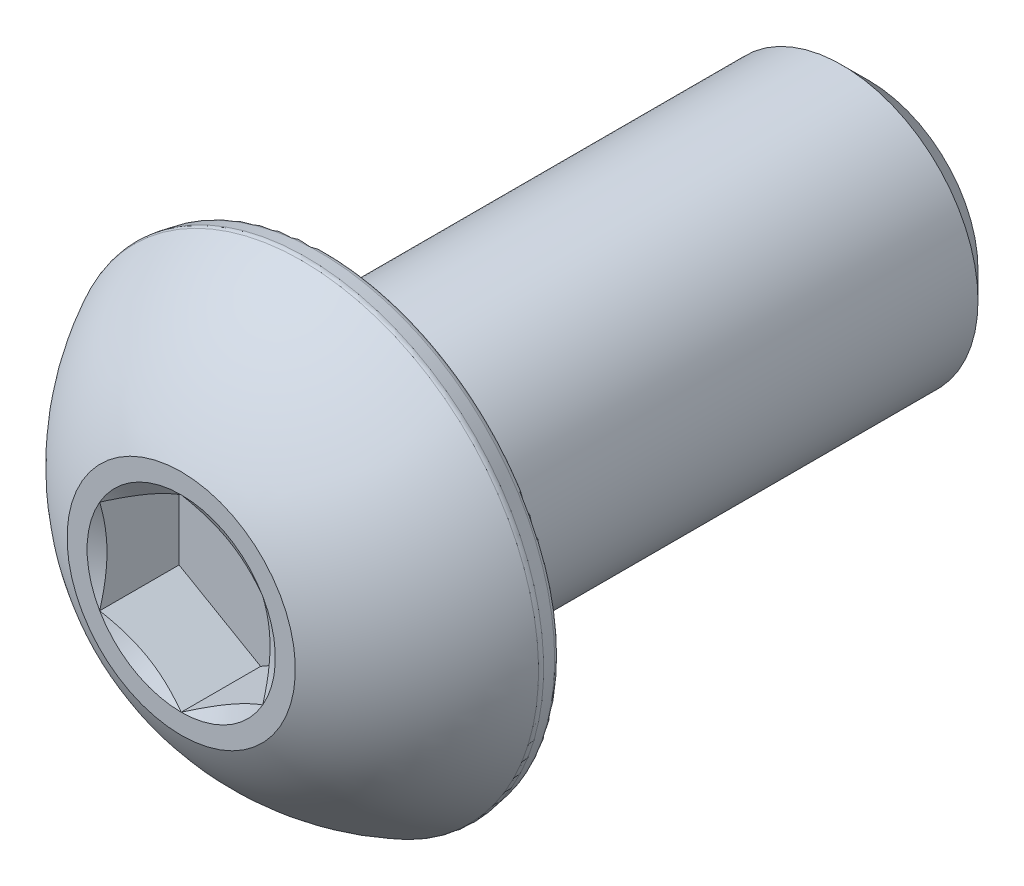
ISO-10303-21;
HEADER;
FILE_DESCRIPTION(('STEP AP214'),'2;1');
FILE_NAME('part.step','',(''),(''),'','','');
FILE_SCHEMA(('AUTOMOTIVE_DESIGN { 1 0 10303 214 1 1 1 1 }'));
ENDSEC;
DATA;
#1=APPLICATION_CONTEXT('core data for automotive mechanical design processes');
#2=APPLICATION_PROTOCOL_DEFINITION('international standard','automotive_design',2000,#1);
#3=PRODUCT_CONTEXT('',#1,'mechanical');
#4=PRODUCT('Part','Part','',(#3));
#5=PRODUCT_RELATED_PRODUCT_CATEGORY('part','',(#4));
#6=PRODUCT_DEFINITION_FORMATION('','',#4);
#7=PRODUCT_DEFINITION_CONTEXT('part definition',#1,'design');
#8=PRODUCT_DEFINITION('design','',#6,#7);
#9=PRODUCT_DEFINITION_SHAPE('','',#8);
#10=(LENGTH_UNIT() NAMED_UNIT(*) SI_UNIT(.MILLI.,.METRE.));
#11=(NAMED_UNIT(*) PLANE_ANGLE_UNIT() SI_UNIT($,.RADIAN.));
#12=(NAMED_UNIT(*) SI_UNIT($,.STERADIAN.) SOLID_ANGLE_UNIT());
#13=UNCERTAINTY_MEASURE_WITH_UNIT(LENGTH_MEASURE(1.E-05),#10,'distance_accuracy_value','');
#14=(GEOMETRIC_REPRESENTATION_CONTEXT(3) GLOBAL_UNCERTAINTY_ASSIGNED_CONTEXT((#13)) GLOBAL_UNIT_ASSIGNED_CONTEXT((#10,
#11,#12)) REPRESENTATION_CONTEXT('',''));
#15=CARTESIAN_POINT('',(0.,0.,0.));
#16=DIRECTION('',(0.,0.,1.));
#17=DIRECTION('',(1.,0.,0.));
#18=AXIS2_PLACEMENT_3D('',#15,#16,#17);
#19=CARTESIAN_POINT('',(0.,0.,10.0457));
#20=DIRECTION('',(0.,0.,-1.));
#21=DIRECTION('',(-1.,0.,0.));
#22=AXIS2_PLACEMENT_3D('',#19,#20,#21);
#23=PLANE('',#22);
#24=CARTESIAN_POINT('',(0.,0.,10.0457));
#25=DIRECTION('',(0.,0.,1.));
#26=DIRECTION('',(1.,0.,0.));
#27=AXIS2_PLACEMENT_3D('',#24,#25,#26);
#28=CIRCLE('',#27,2.74963065701559);
#29=CARTESIAN_POINT('',(-2.38125,1.3748153285078,10.0457));
#30=VERTEX_POINT('',#29);
#31=CARTESIAN_POINT('',(-2.38125,-1.3748153285078,10.0457));
#32=VERTEX_POINT('',#31);
#33=EDGE_CURVE('E87',#30,#32,#28,.T.);
#34=ORIENTED_EDGE('',*,*,#33,.F.);
#35=CARTESIAN_POINT('',(0.,2.74963065701559,10.0457));
#36=VERTEX_POINT('',#35);
#37=EDGE_CURVE('E96',#36,#30,#28,.T.);
#38=ORIENTED_EDGE('',*,*,#37,.F.);
#39=CARTESIAN_POINT('',(2.38125,1.3748153285078,10.0457));
#40=VERTEX_POINT('',#39);
#41=EDGE_CURVE('E47',#40,#36,#28,.T.);
#42=ORIENTED_EDGE('',*,*,#41,.F.);
#43=CARTESIAN_POINT('',(2.38125,-1.3748153285078,10.0457));
#44=VERTEX_POINT('',#43);
#45=EDGE_CURVE('E54',#44,#40,#28,.T.);
#46=ORIENTED_EDGE('',*,*,#45,.F.);
#47=CARTESIAN_POINT('',(0.,-2.74963065701559,10.0457));
#48=VERTEX_POINT('',#47);
#49=EDGE_CURVE('E129',#48,#44,#28,.T.);
#50=ORIENTED_EDGE('',*,*,#49,.F.);
#51=EDGE_CURVE('E97',#32,#48,#28,.T.);
#52=ORIENTED_EDGE('',*,*,#51,.F.);
#53=EDGE_LOOP('',(#34,#38,#42,#46,#50,#52));
#54=FACE_BOUND('',#53,.T.);
#55=CARTESIAN_POINT('',(0.,0.,10.0457));
#56=DIRECTION('',(0.,0.,1.));
#57=DIRECTION('',(1.,0.,0.));
#58=AXIS2_PLACEMENT_3D('',#55,#56,#57);
#59=CIRCLE('',#58,3.33375);
#60=CARTESIAN_POINT('',(0.,3.33375,10.0457));
#61=VERTEX_POINT('',#60);
#62=EDGE_CURVE('E108',#61,#61,#59,.T.);
#63=ORIENTED_EDGE('',*,*,#62,.T.);
#64=EDGE_LOOP('',(#63));
#65=FACE_BOUND('',#64,.T.);
#66=ADVANCED_FACE('F33',(#54,#65),#23,.F.);
#67=CARTESIAN_POINT('',(0.,0.,3.0715100761871));
#68=DIRECTION('',(0.,0.,1.));
#69=DIRECTION('',(0.,1.,0.));
#70=AXIS2_PLACEMENT_3D('',#67,#68,#69);
#71=SPHERICAL_SURFACE('',#70,7.7300203205369);
#72=CARTESIAN_POINT('',(0.,0.,6.52454018330078));
#73=DIRECTION('',(0.,0.,-1.));
#74=DIRECTION('',(-1.,0.,0.));
#75=AXIS2_PLACEMENT_3D('',#72,#73,#74);
#76=CIRCLE('',#75,6.9159089955898);
#77=CARTESIAN_POINT('',(0.,6.91590899558979,6.52454018330078));
#78=VERTEX_POINT('',#77);
#79=EDGE_CURVE('E107',#78,#78,#76,.F.);
#80=CARTESIAN_POINT('',(0.,6.91590899558979,6.52454018330078));
#81=CARTESIAN_POINT('',(0.,6.89210420071315,6.57221785887908));
#82=CARTESIAN_POINT('',(0.,6.86780623065835,6.6196492946389));
#83=CARTESIAN_POINT('',(0.,6.81823466199059,6.71399957213813));
#84=CARTESIAN_POINT('',(0.,6.79296106337765,6.76091841387754));
#85=CARTESIAN_POINT('',(0.,6.74144895939183,6.85422338895248));
#86=CARTESIAN_POINT('',(0.,6.71521045401895,6.90060952228801));
#87=CARTESIAN_POINT('',(0.,6.6617797828335,6.99282925276766));
#88=CARTESIAN_POINT('',(0.,6.63458761702092,7.03866284991179));
#89=CARTESIAN_POINT('',(0.,6.57926124921401,7.12975790080985));
#90=CARTESIAN_POINT('',(0.,6.55112704721968,7.1750193545638));
#91=CARTESIAN_POINT('',(0.,6.49392864226128,7.26495076041678));
#92=CARTESIAN_POINT('',(0.,6.46486443929721,7.30962071251583));
#93=CARTESIAN_POINT('',(0.,6.40581846323881,7.3983500086603));
#94=CARTESIAN_POINT('',(0.,6.37583669014447,7.44240935270572));
#95=CARTESIAN_POINT('',(0.,6.31496839770298,7.52989858781531));
#96=CARTESIAN_POINT('',(0.,6.28408187835583,7.57332847887949));
#97=CARTESIAN_POINT('',(0.,6.22141730410836,7.65954023224645));
#98=CARTESIAN_POINT('',(0.,6.18963924920803,7.70232209454923));
#99=CARTESIAN_POINT('',(0.,6.12520519592135,7.78721949180882));
#100=CARTESIAN_POINT('',(0.,6.092549197535,7.82933502676563));
#101=CARTESIAN_POINT('',(0.,6.02637322484493,7.91288175574332));
#102=CARTESIAN_POINT('',(0.,5.99285325054121,7.9543129497642));
#103=CARTESIAN_POINT('',(0.,5.92496366312639,8.03647327598684));
#104=CARTESIAN_POINT('',(0.,5.8905940500153,8.0772024081886));
#105=CARTESIAN_POINT('',(0.,5.82101988550109,8.15794119017415));
#106=CARTESIAN_POINT('',(0.,5.78581533409797,8.19795083995793));
#107=CARTESIAN_POINT('',(0.,5.71458635063374,8.27723354424464));
#108=CARTESIAN_POINT('',(0.,5.67856191857262,8.31650659874756));
#109=CARTESIAN_POINT('',(0.,5.60570858210438,8.39429931466497));
#110=CARTESIAN_POINT('',(0.,5.56887967769726,8.43281897607945));
#111=CARTESIAN_POINT('',(0.,5.49443314893664,8.50908843025251));
#112=CARTESIAN_POINT('',(0.,5.45681552458314,8.54683822301108));
#113=CARTESIAN_POINT('',(0.,5.38080764567942,8.62155179359178));
#114=CARTESIAN_POINT('',(0.,5.3424173911292,8.65851557141393));
#115=CARTESIAN_POINT('',(0.,5.26488067204982,8.73164130203432));
#116=CARTESIAN_POINT('',(0.,5.22573420752066,8.76780325483257));
#117=CARTESIAN_POINT('',(0.,5.14670181214611,8.83930986827302));
#118=CARTESIAN_POINT('',(0.,5.10681588130072,8.87465452891522));
#119=CARTESIAN_POINT('',(0.,5.02632161323976,8.94451144048231));
#120=CARTESIAN_POINT('',(0.,4.98571327602419,8.97902369140719));
#121=CARTESIAN_POINT('',(0.,4.90379156415538,9.04720102201527));
#122=CARTESIAN_POINT('',(0.,4.86247818950214,9.08086610169847));
#123=CARTESIAN_POINT('',(0.,4.77916407324809,9.14733469064972));
#124=CARTESIAN_POINT('',(0.,4.73716333164727,9.18013819991778));
#125=CARTESIAN_POINT('',(0.,4.65249244598724,9.24486961737403));
#126=CARTESIAN_POINT('',(0.,4.60982230192803,9.27679752556221));
#127=CARTESIAN_POINT('',(0.,4.52383086215762,9.33976408470765));
#128=CARTESIAN_POINT('',(0.,4.48050956644643,9.3708027356649));
#129=CARTESIAN_POINT('',(0.,4.39323435268239,9.43197750453789));
#130=CARTESIAN_POINT('',(0.,4.34928043462955,9.46211362245364));
#131=CARTESIAN_POINT('',(0.,4.26075877609776,9.52147043550477));
#132=CARTESIAN_POINT('',(0.,4.21619103561882,9.55069113064015));
#133=CARTESIAN_POINT('',(0.,4.12646079461508,9.60820459977906));
#134=CARTESIAN_POINT('',(0.,4.08129829409027,9.63649737378258));
#135=CARTESIAN_POINT('',(0.,3.9903978500577,9.69214289977668));
#136=CARTESIAN_POINT('',(0.,3.94465990654993,9.71949565176726));
#137=CARTESIAN_POINT('',(0.,3.85262813864884,9.77324943274895));
#138=CARTESIAN_POINT('',(0.,3.80633431425552,9.79965046174005));
#139=CARTESIAN_POINT('',(0.,3.71321058852053,9.85148951090479));
#140=CARTESIAN_POINT('',(0.,3.66638068717887,9.87692753107842));
#141=CARTESIAN_POINT('',(0.,3.57220482555009,9.92682965846051));
#142=CARTESIAN_POINT('',(0.,3.52485886526298,9.95129376566896));
#143=CARTESIAN_POINT('',(0.,3.42967118129194,9.99923769233952));
#144=CARTESIAN_POINT('',(0.,3.38182945760801,10.0227175118016));
#145=CARTESIAN_POINT('',(0.,3.33375,10.0457));
#146=B_SPLINE_CURVE_WITH_KNOTS('',3,(#80,#81,#82,#83,#84,#85,#86,#87,#88,#89,#90,#91,#92,#93,
#94,#95,#96,#97,#98,#99,#100,#101,#102,#103,#104,#105,#106,#107,#108,#109,#110,#111,#112,#113,
#114,#115,#116,#117,#118,#119,#120,#121,#122,#123,#124,#125,#126,#127,#128,#129,#130,#131,#132,
#133,#134,#135,#136,#137,#138,#139,#140,#141,#142,#143,#144,#145),.UNSPECIFIED.,.F.,.F.,(4,2,2,
2,2,2,2,2,2,2,2,2,2,2,2,2,2,2,2,2,2,2,2,2,2,2,2,2,2,2,2,2,4),(0.,0.159867283823277,
0.319734567646554,0.479601851469831,0.639469135293107,0.799336419116385,0.959203702939662,
1.11907098676294,1.27893827058622,1.43880555440949,1.59867283823277,1.75854012205605,
1.91840740587932,2.0782746897026,2.23814197352588,2.39800925734915,2.55787654117243,
2.71774382499571,2.87761110881898,3.03747839264226,3.19734567646554,3.35721296028882,
3.51708024411209,3.67694752793537,3.83681481175865,3.99668209558192,4.1565493794052,
4.31641666322848,4.47628394705175,4.63615123087503,4.79601851469831,4.95588579852158,
5.11575308234486),.UNSPECIFIED.);
#147=EDGE_CURVE('BSEAM202',#78,#61,#146,.T.);
#148=ORIENTED_EDGE('',*,*,#79,.T.);
#149=ORIENTED_EDGE('',*,*,#62,.F.);
#150=ORIENTED_EDGE('',*,*,#147,.T.);
#151=ORIENTED_EDGE('',*,*,#147,.F.);
#152=EDGE_LOOP('',(#148,#150,#149,#151));
#153=FACE_BOUND('',#152,.T.);
#154=ADVANCED_FACE('F202',(#153),#71,.T.);
#155=CARTESIAN_POINT('',(0.,0.,5.8293));
#156=DIRECTION('',(0.,0.,1.));
#157=DIRECTION('',(1.,0.,0.));
#158=AXIS2_PLACEMENT_3D('',#155,#156,#157);
#159=CONICAL_SURFACE('',#158,6.83538023778113,0.174532925199432);
#160=CARTESIAN_POINT('',(0.,0.,6.39375756148203));
#161=DIRECTION('',(0.,0.,-1.));
#162=DIRECTION('',(-1.,0.,0.));
#163=AXIS2_PLACEMENT_3D('',#160,#161,#162);
#164=CIRCLE('',#163,6.93490933533532);
#165=CARTESIAN_POINT('',(-6.93490933533532,0.,6.39375756148203));
#166=VERTEX_POINT('',#165);
#167=EDGE_CURVE('E41',#166,#166,#164,.T.);
#168=ORIENTED_EDGE('',*,*,#167,.T.);
#169=EDGE_LOOP('',(#168));
#170=FACE_BOUND('',#169,.T.);
#171=CARTESIAN_POINT('',(0.,0.,6.00351149118426));
#172=DIRECTION('',(0.,0.,-1.));
#173=DIRECTION('',(-1.,0.,0.));
#174=AXIS2_PLACEMENT_3D('',#171,#172,#173);
#175=CIRCLE('',#174,6.86609842402637);
#176=CARTESIAN_POINT('',(-6.86609842402637,0.,6.00351149118426));
#177=VERTEX_POINT('',#176);
#178=EDGE_CURVE('E224',#177,#177,#175,.F.);
#179=ORIENTED_EDGE('',*,*,#178,.T.);
#180=EDGE_LOOP('',(#179));
#181=FACE_BOUND('',#180,.T.);
#182=ADVANCED_FACE('F207',(#170,#181),#159,.T.);
#183=CARTESIAN_POINT('',(0.,6.83538023778113,5.8293));
#184=DIRECTION('',(0.,0.,1.));
#185=DIRECTION('',(1.,0.,0.));
#186=AXIS2_PLACEMENT_3D('',#183,#184,#185);
#187=PLANE('',#186);
#188=CARTESIAN_POINT('',(0.,0.,5.8293));
#189=DIRECTION('',(0.,0.,1.));
#190=DIRECTION('',(1.,0.,0.));
#191=AXIS2_PLACEMENT_3D('',#188,#189,#190);
#192=CIRCLE('',#191,6.65848125353633);
#193=CARTESIAN_POINT('',(6.65848125353633,0.,5.8293));
#194=VERTEX_POINT('',#193);
#195=EDGE_CURVE('E11',#194,#194,#192,.F.);
#196=ORIENTED_EDGE('',*,*,#195,.T.);
#197=EDGE_LOOP('',(#196));
#198=FACE_BOUND('',#197,.T.);
#199=CARTESIAN_POINT('',(0.,0.,5.8293));
#200=DIRECTION('',(0.,0.,1.));
#201=DIRECTION('',(1.,0.,0.));
#202=AXIS2_PLACEMENT_3D('',#199,#200,#201);
#203=CIRCLE('',#202,3.9751);
#204=CARTESIAN_POINT('',(3.9751,0.,5.8293));
#205=VERTEX_POINT('',#204);
#206=EDGE_CURVE('E289',#205,#205,#203,.T.);
#207=ORIENTED_EDGE('',*,*,#206,.T.);
#208=EDGE_LOOP('',(#207));
#209=FACE_BOUND('',#208,.T.);
#210=ADVANCED_FACE('F230',(#198,#209),#187,.F.);
#211=CARTESIAN_POINT('',(0.,0.,10.0457));
#212=DIRECTION('',(0.,0.,1.));
#213=DIRECTION('',(1.,0.,0.));
#214=AXIS2_PLACEMENT_3D('',#211,#212,#213);
#215=CYLINDRICAL_SURFACE('',#214,3.9751);
#216=ORIENTED_EDGE('',*,*,#206,.F.);
#217=EDGE_LOOP('',(#216));
#218=FACE_BOUND('',#217,.T.);
#219=CARTESIAN_POINT('',(0.,0.,-9.25194999999998));
#220=DIRECTION('',(0.,0.,1.));
#221=DIRECTION('',(1.,0.,0.));
#222=AXIS2_PLACEMENT_3D('',#219,#220,#221);
#223=CIRCLE('',#222,3.9751);
#224=CARTESIAN_POINT('',(3.9751,0.,-9.25194999999998));
#225=VERTEX_POINT('',#224);
#226=EDGE_CURVE('E286',#225,#225,#223,.T.);
#227=ORIENTED_EDGE('',*,*,#226,.T.);
#228=EDGE_LOOP('',(#227));
#229=FACE_BOUND('',#228,.T.);
#230=ADVANCED_FACE('F236',(#218,#229),#215,.T.);
#231=CARTESIAN_POINT('',(0.,0.,-10.0457));
#232=DIRECTION('',(0.,0.,1.));
#233=DIRECTION('',(1.,0.,0.));
#234=AXIS2_PLACEMENT_3D('',#231,#232,#233);
#235=CONICAL_SURFACE('',#234,3.18134999999999,0.785398163397442);
#236=ORIENTED_EDGE('',*,*,#226,.F.);
#237=EDGE_LOOP('',(#236));
#238=FACE_BOUND('',#237,.T.);
#239=CARTESIAN_POINT('',(0.,0.,-10.0457));
#240=DIRECTION('',(0.,0.,1.));
#241=DIRECTION('',(1.,0.,0.));
#242=AXIS2_PLACEMENT_3D('',#239,#240,#241);
#243=CIRCLE('',#242,3.18134999999999);
#244=CARTESIAN_POINT('',(3.18134999999999,0.,-10.0457));
#245=VERTEX_POINT('',#244);
#246=EDGE_CURVE('E274',#245,#245,#243,.T.);
#247=ORIENTED_EDGE('',*,*,#246,.T.);
#248=EDGE_LOOP('',(#247));
#249=FACE_BOUND('',#248,.T.);
#250=ADVANCED_FACE('F242',(#238,#249),#235,.T.);
#251=CARTESIAN_POINT('',(0.,0.,-10.0457));
#252=DIRECTION('',(0.,0.,1.));
#253=DIRECTION('',(1.,0.,0.));
#254=AXIS2_PLACEMENT_3D('',#251,#252,#253);
#255=PLANE('',#254);
#256=ORIENTED_EDGE('',*,*,#246,.F.);
#257=EDGE_LOOP('',(#256));
#258=FACE_BOUND('',#257,.T.);
#259=ADVANCED_FACE('F246',(#258),#255,.F.);
#260=CARTESIAN_POINT('',(0.,0.,10.0457));
#261=DIRECTION('',(0.,0.,1.));
#262=DIRECTION('',(1.,0.,0.));
#263=AXIS2_PLACEMENT_3D('',#260,#261,#262);
#264=CONICAL_SURFACE('',#263,2.74963065701559,1.0471975511966);
#265=ORIENTED_EDGE('',*,*,#51,.T.);
#266=CARTESIAN_POINT('',(-2.38145,-1.37469985845396,10.045766670866));
#267=CARTESIAN_POINT('',(-2.27680510857802,-1.43511661468576,10.0108705786252));
#268=CARTESIAN_POINT('',(-2.1712569313955,-1.49605488319456,9.97913357277489));
#269=CARTESIAN_POINT('',(-1.95833280582789,-1.61898668440799,9.92373566282311));
#270=CARTESIAN_POINT('',(-1.85095307338658,-1.68098240183848,9.90009435758363));
#271=CARTESIAN_POINT('',(-1.63752441306379,-1.80420549632863,9.86329233539692));
#272=CARTESIAN_POINT('',(-1.53150832846243,-1.86541391131165,9.84988669656405));
#273=CARTESIAN_POINT('',(-1.31897718209788,-1.98811882587641,9.83388161450448));
#274=CARTESIAN_POINT('',(-1.21246289310218,-2.04961487930061,9.83126891931468));
#275=CARTESIAN_POINT('',(-1.01342600969027,-2.16452887751714,9.83669708045716));
#276=CARTESIAN_POINT('',(-0.920873657438137,-2.21796400300405,9.84340513694891));
#277=CARTESIAN_POINT('',(-0.736371946153154,-2.32448611568038,9.86466796071296));
#278=CARTESIAN_POINT('',(-0.644423225529254,-2.37757273428423,9.87922999512354));
#279=CARTESIAN_POINT('',(-0.459540942889936,-2.48431456993443,9.91563482881656));
#280=CARTESIAN_POINT('',(-0.366630787034621,-2.53795627342795,9.93763198497274));
#281=CARTESIAN_POINT('',(-0.182196405744562,-2.64443951311359,9.98755721470183));
#282=CARTESIAN_POINT('',(-0.0906698164537948,-2.69728241407862,10.0154735535082));
#283=CARTESIAN_POINT('',(0.000200000000000513,-2.74974612706943,10.045766670866));
#284=B_SPLINE_CURVE_WITH_KNOTS('',3,(#266,#267,#268,#269,#270,#271,#272,#273,#274,#275,#276,
#277,#278,#279,#280,#281,#282,#283),.UNSPECIFIED.,.F.,.F.,(4,2,2,2,2,2,2,2,4),(0.,
0.377463001720441,0.755833447356088,1.12483885453941,1.49339104874267,1.81432726847354,
2.1355609551887,2.46392121913821,2.79163649648301),.UNSPECIFIED.);
#285=EDGE_CURVE('E102',#32,#48,#284,.T.);
#286=ORIENTED_EDGE('',*,*,#285,.F.);
#287=EDGE_LOOP('',(#265,#286));
#288=FACE_BOUND('',#287,.T.);
#289=ADVANCED_FACE('F103',(#288),#264,.F.);
#290=ORIENTED_EDGE('',*,*,#49,.T.);
#291=CARTESIAN_POINT('',(-0.000199999999999475,-2.74974612706943,10.045766670866));
#292=CARTESIAN_POINT('',(0.104444891421977,-2.68932937083763,10.0108705786252));
#293=CARTESIAN_POINT('',(0.209993068604497,-2.62839110232883,9.97913357277489));
#294=CARTESIAN_POINT('',(0.422917194172111,-2.5054593011154,9.92373566282311));
#295=CARTESIAN_POINT('',(0.530296926613419,-2.4434635836849,9.90009435758363));
#296=CARTESIAN_POINT('',(0.743725586936214,-2.32024048919476,9.86329233539692));
#297=CARTESIAN_POINT('',(0.849741671537568,-2.25903207421173,9.84988669656405));
#298=CARTESIAN_POINT('',(1.06227281790212,-2.13632715964698,9.83388161450448));
#299=CARTESIAN_POINT('',(1.16878710689782,-2.07483110622277,9.83126891931468));
#300=CARTESIAN_POINT('',(1.36782399030972,-1.95991710800624,9.83669708045716));
#301=CARTESIAN_POINT('',(1.46037634256186,-1.90648198251934,9.84340513694891));
#302=CARTESIAN_POINT('',(1.64487805384685,-1.79995986984301,9.86466796071296));
#303=CARTESIAN_POINT('',(1.73682677447075,-1.74687325123916,9.87922999512354));
#304=CARTESIAN_POINT('',(1.92170905711006,-1.64013141558896,9.91563482881656));
#305=CARTESIAN_POINT('',(2.01461921296538,-1.58648971209544,9.93763198497274));
#306=CARTESIAN_POINT('',(2.19905359425544,-1.4800064724098,9.98755721470183));
#307=CARTESIAN_POINT('',(2.29058018354621,-1.42716357144477,10.0154735535082));
#308=CARTESIAN_POINT('',(2.38145,-1.37469985845396,10.045766670866));
#309=B_SPLINE_CURVE_WITH_KNOTS('',3,(#291,#292,#293,#294,#295,#296,#297,#298,#299,#300,#301,
#302,#303,#304,#305,#306,#307,#308),.UNSPECIFIED.,.F.,.F.,(4,2,2,2,2,2,2,2,4),(0.,
0.377463001720441,0.755833447356087,1.1248388545394,1.49339104874266,1.81432726847354,
2.1355609551887,2.46392121913821,2.79163649648301),.UNSPECIFIED.);
#310=EDGE_CURVE('E131',#48,#44,#309,.T.);
#311=ORIENTED_EDGE('',*,*,#310,.F.);
#312=EDGE_LOOP('',(#290,#311));
#313=FACE_BOUND('',#312,.T.);
#314=ADVANCED_FACE('F315',(#313),#264,.F.);
#315=ORIENTED_EDGE('',*,*,#45,.T.);
#316=CARTESIAN_POINT('',(2.38125,-3.56031432041408,10.9311327813109));
#317=CARTESIAN_POINT('',(2.38125,-3.45748374459471,10.8817985621719));
#318=CARTESIAN_POINT('',(2.38125,-3.35440265943941,10.8329767676642));
#319=CARTESIAN_POINT('',(2.38125,-3.14760595557445,10.736648717798));
#320=CARTESIAN_POINT('',(2.38125,-3.04389022671774,10.6891426991917));
#321=CARTESIAN_POINT('',(2.38125,-2.83509604479695,10.5954714977183));
#322=CARTESIAN_POINT('',(2.38125,-2.73001314180502,10.5493161964771));
#323=CARTESIAN_POINT('',(2.38125,-2.5189655488985,10.4590753131819));
#324=CARTESIAN_POINT('',(2.38125,-2.41300090517102,10.4149896235117));
#325=CARTESIAN_POINT('',(2.38125,-2.19722997657368,10.3283164755131));
#326=CARTESIAN_POINT('',(2.38125,-2.08739568642801,10.2857983262348));
#327=CARTESIAN_POINT('',(2.38125,-1.86639857650948,10.2042970218555));
#328=CARTESIAN_POINT('',(2.38125,-1.75523560433474,10.1653142767613));
#329=CARTESIAN_POINT('',(2.38125,-1.53166103833463,10.0919985594297));
#330=CARTESIAN_POINT('',(2.38125,-1.41925300915091,10.0576548339663));
#331=CARTESIAN_POINT('',(2.38125,-1.19282596671567,9.99479165918739));
#332=CARTESIAN_POINT('',(2.38125,-1.07880736110514,9.96627076337095));
#333=CARTESIAN_POINT('',(2.38125,-0.849396676134232,9.91657362588166));
#334=CARTESIAN_POINT('',(2.38125,-0.734007929376445,9.89538229924999));
#335=CARTESIAN_POINT('',(2.38125,-0.50193948238959,9.86173194464909));
#336=CARTESIAN_POINT('',(2.38125,-0.385259869941055,9.84927232657502));
#337=CARTESIAN_POINT('',(2.38125,-0.15265374437568,9.83424139756692));
#338=CARTESIAN_POINT('',(2.38125,-0.0367349582255528,9.83155339793735));
#339=CARTESIAN_POINT('',(2.38125,0.194921420761424,9.83599358753839));
#340=CARTESIAN_POINT('',(2.38125,0.310659001934531,9.84312238458818));
#341=CARTESIAN_POINT('',(2.38125,0.511064358227532,9.8634854394961));
#342=CARTESIAN_POINT('',(2.38125,0.595953717526416,9.87463938794046));
#343=CARTESIAN_POINT('',(2.38125,0.765022556422735,9.90146121817604));
#344=CARTESIAN_POINT('',(2.38125,0.849201910592196,9.91712988102057));
#345=CARTESIAN_POINT('',(2.38125,1.10063158151713,9.97007925010245));
#346=CARTESIAN_POINT('',(2.38125,1.26664254896707,10.0132883896334));
#347=CARTESIAN_POINT('',(2.38125,1.51487878922651,10.0871090899076));
#348=CARTESIAN_POINT('',(2.38125,1.59841261020007,10.1135615121722));
#349=CARTESIAN_POINT('',(2.38125,1.76461552147617,10.1689125840672));
#350=CARTESIAN_POINT('',(2.38125,1.8472851157426,10.1978097070595));
#351=CARTESIAN_POINT('',(2.38125,2.0118638893944,10.2576314662197));
#352=CARTESIAN_POINT('',(2.38125,2.09377320390112,10.2885557339181));
#353=CARTESIAN_POINT('',(2.38125,2.25694684606751,10.3520968176601));
#354=CARTESIAN_POINT('',(2.38125,2.33821106206296,10.3847139196664));
#355=CARTESIAN_POINT('',(2.38125,2.54564055797726,10.4700605981753));
#356=CARTESIAN_POINT('',(2.38125,2.67139077643561,10.5237976536597));
#357=CARTESIAN_POINT('',(2.38125,2.92175828712318,10.6338569837741));
#358=CARTESIAN_POINT('',(2.38125,3.04637549364049,10.6901794520717));
#359=CARTESIAN_POINT('',(2.38125,3.29471124185556,10.804822490172));
#360=CARTESIAN_POINT('',(2.38125,3.41842962310426,10.8631434065869));
#361=CARTESIAN_POINT('',(2.38125,3.66512129458494,10.9813427619708));
#362=CARTESIAN_POINT('',(2.38125,3.78809456817208,11.0412212355767));
#363=CARTESIAN_POINT('',(2.38125,4.15640373223128,11.2228342351465));
#364=CARTESIAN_POINT('',(2.38125,4.40083218751396,11.3464072817698));
#365=CARTESIAN_POINT('',(2.38125,4.8880155134677,11.596713712694));
#366=CARTESIAN_POINT('',(2.38125,5.13077059191436,11.7234466952773));
#367=CARTESIAN_POINT('',(2.38125,5.59226335071453,11.9670405276704));
#368=CARTESIAN_POINT('',(2.38125,5.81110530618685,12.0837041437275));
#369=CARTESIAN_POINT('',(2.38125,6.24808533417811,12.3183596021958));
#370=CARTESIAN_POINT('',(2.38125,6.46622338026151,12.4363514937607));
#371=CARTESIAN_POINT('',(2.38125,6.90140294653572,12.6730300538684));
#372=CARTESIAN_POINT('',(2.38125,7.11844584451928,12.7917141918825));
#373=CARTESIAN_POINT('',(2.38125,7.55209283139576,13.0298549301874));
#374=CARTESIAN_POINT('',(2.38125,7.7686969426581,13.1493114897285));
#375=CARTESIAN_POINT('',(2.38125,7.98514341619629,13.2690511700018));
#376=B_SPLINE_CURVE_WITH_KNOTS('',3,(#316,#317,#318,#319,#320,#321,#322,#323,#324,#325,#326,
#327,#328,#329,#330,#331,#332,#333,#334,#335,#336,#337,#338,#339,#340,#341,#342,#343,#344,#345,
#346,#347,#348,#349,#350,#351,#352,#353,#354,#355,#356,#357,#358,#359,#360,#361,#362,#363,#364,
#365,#366,#367,#368,#369,#370,#371,#372,#373,#374,#375),.UNSPECIFIED.,.F.,.F.,(4,2,2,2,2,2,2,2,
2,2,2,2,2,2,2,2,2,2,2,2,2,2,2,2,2,2,2,2,2,4),(0.,0.34216262334821,0.684386418445571,
1.02868615523156,1.37296796912697,1.72625126026709,2.07957547001313,2.43206608144725,
2.78446902072291,3.13614230382947,3.48779181791892,3.83522802132629,4.18268573764542,
4.43941585883896,4.69619042147775,5.21013322351853,5.47298093255488,5.73566569629106,
5.99830284411161,6.26098450333651,6.67119502065648,7.08143631626132,7.49174912817907,
7.90207107246849,8.72369797816941,9.54522095899754,10.2892038704941,11.0332144046983,
11.7753325322695,12.5174118231823),.UNSPECIFIED.);
#377=EDGE_CURVE('E140',#44,#40,#376,.T.);
#378=ORIENTED_EDGE('',*,*,#377,.F.);
#379=EDGE_LOOP('',(#315,#378));
#380=FACE_BOUND('',#379,.T.);
#381=ADVANCED_FACE('F311',(#380),#264,.F.);
#382=ORIENTED_EDGE('',*,*,#41,.T.);
#383=CARTESIAN_POINT('',(2.38145,1.37469985845396,10.045766670866));
#384=CARTESIAN_POINT('',(2.27680510857802,1.43511661468576,10.0108705786252));
#385=CARTESIAN_POINT('',(2.1712569313955,1.49605488319456,9.97913357277489));
#386=CARTESIAN_POINT('',(1.95833280582789,1.61898668440799,9.92373566282311));
#387=CARTESIAN_POINT('',(1.85095307338658,1.68098240183849,9.90009435758363));
#388=CARTESIAN_POINT('',(1.63752441306379,1.80420549632863,9.86329233539692));
#389=CARTESIAN_POINT('',(1.53150832846243,1.86541391131166,9.84988669656405));
#390=CARTESIAN_POINT('',(1.31897718209788,1.98811882587641,9.83388161450448));
#391=CARTESIAN_POINT('',(1.21246289310218,2.04961487930062,9.83126891931468));
#392=CARTESIAN_POINT('',(1.01342600969027,2.16452887751715,9.83669708045716));
#393=CARTESIAN_POINT('',(0.920873657438137,2.21796400300405,9.84340513694891));
#394=CARTESIAN_POINT('',(0.736371946153154,2.32448611568038,9.86466796071296));
#395=CARTESIAN_POINT('',(0.644423225529254,2.37757273428423,9.87922999512354));
#396=CARTESIAN_POINT('',(0.459540942889936,2.48431456993443,9.91563482881656));
#397=CARTESIAN_POINT('',(0.366630787034621,2.53795627342795,9.93763198497274));
#398=CARTESIAN_POINT('',(0.182196405744562,2.64443951311359,9.98755721470183));
#399=CARTESIAN_POINT('',(0.0906698164537951,2.69728241407862,10.0154735535082));
#400=CARTESIAN_POINT('',(-0.000200000000000014,2.74974612706943,10.045766670866));
#401=B_SPLINE_CURVE_WITH_KNOTS('',3,(#383,#384,#385,#386,#387,#388,#389,#390,#391,#392,#393,
#394,#395,#396,#397,#398,#399,#400),.UNSPECIFIED.,.F.,.F.,(4,2,2,2,2,2,2,2,4),(0.,
0.377463001720441,0.755833447356088,1.12483885453941,1.49339104874267,1.81432726847354,
2.1355609551887,2.46392121913821,2.79163649648301),.UNSPECIFIED.);
#402=EDGE_CURVE('E167',#40,#36,#401,.T.);
#403=ORIENTED_EDGE('',*,*,#402,.F.);
#404=EDGE_LOOP('',(#382,#403));
#405=FACE_BOUND('',#404,.T.);
#406=ADVANCED_FACE('F307',(#405),#264,.F.);
#407=ORIENTED_EDGE('',*,*,#37,.T.);
#408=CARTESIAN_POINT('',(0.000199999999999407,2.74974612706943,10.045766670866));
#409=CARTESIAN_POINT('',(-0.104444891421977,2.68932937083764,10.0108705786252));
#410=CARTESIAN_POINT('',(-0.209993068604497,2.62839110232883,9.97913357277489));
#411=CARTESIAN_POINT('',(-0.422917194172112,2.5054593011154,9.92373566282311));
#412=CARTESIAN_POINT('',(-0.53029692661342,2.4434635836849,9.90009435758363));
#413=CARTESIAN_POINT('',(-0.743725586936215,2.32024048919476,9.86329233539692));
#414=CARTESIAN_POINT('',(-0.849741671537569,2.25903207421174,9.84988669656405));
#415=CARTESIAN_POINT('',(-1.06227281790212,2.13632715964698,9.83388161450448));
#416=CARTESIAN_POINT('',(-1.16878710689782,2.07483110622278,9.83126891931468));
#417=CARTESIAN_POINT('',(-1.36782399030973,1.95991710800625,9.83669708045716));
#418=CARTESIAN_POINT('',(-1.46037634256186,1.90648198251934,9.84340513694891));
#419=CARTESIAN_POINT('',(-1.64487805384685,1.79995986984301,9.86466796071296));
#420=CARTESIAN_POINT('',(-1.73682677447075,1.74687325123916,9.87922999512354));
#421=CARTESIAN_POINT('',(-1.92170905711006,1.64013141558896,9.91563482881656));
#422=CARTESIAN_POINT('',(-2.01461921296538,1.58648971209544,9.93763198497274));
#423=CARTESIAN_POINT('',(-2.19905359425544,1.4800064724098,9.98755721470183));
#424=CARTESIAN_POINT('',(-2.29058018354621,1.42716357144477,10.0154735535082));
#425=CARTESIAN_POINT('',(-2.38145,1.37469985845396,10.045766670866));
#426=B_SPLINE_CURVE_WITH_KNOTS('',3,(#408,#409,#410,#411,#412,#413,#414,#415,#416,#417,#418,
#419,#420,#421,#422,#423,#424,#425),.UNSPECIFIED.,.F.,.F.,(4,2,2,2,2,2,2,2,4),(0.,
0.377463001720441,0.755833447356088,1.12483885453941,1.49339104874267,1.81432726847354,
2.1355609551887,2.46392121913821,2.79163649648301),.UNSPECIFIED.);
#427=EDGE_CURVE('E118',#36,#30,#426,.T.);
#428=ORIENTED_EDGE('',*,*,#427,.F.);
#429=EDGE_LOOP('',(#407,#428));
#430=FACE_BOUND('',#429,.T.);
#431=ADVANCED_FACE('F154',(#430),#264,.F.);
#432=ORIENTED_EDGE('',*,*,#33,.T.);
#433=CARTESIAN_POINT('',(-2.38125,-3.56031432041408,10.9311327813109));
#434=CARTESIAN_POINT('',(-2.38125,-3.45748374459471,10.8817985621719));
#435=CARTESIAN_POINT('',(-2.38125,-3.35440265943942,10.8329767676642));
#436=CARTESIAN_POINT('',(-2.38125,-3.14760595557446,10.736648717798));
#437=CARTESIAN_POINT('',(-2.38125,-3.04389022671774,10.6891426991917));
#438=CARTESIAN_POINT('',(-2.38125,-2.83509604479696,10.5954714977183));
#439=CARTESIAN_POINT('',(-2.38125,-2.73001314180502,10.5493161964771));
#440=CARTESIAN_POINT('',(-2.38125,-2.5189655488985,10.4590753131819));
#441=CARTESIAN_POINT('',(-2.38125,-2.41300090517103,10.4149896235117));
#442=CARTESIAN_POINT('',(-2.38125,-2.19722997657368,10.3283164755131));
#443=CARTESIAN_POINT('',(-2.38125,-2.08739568642801,10.2857983262348));
#444=CARTESIAN_POINT('',(-2.38125,-1.86639857650948,10.2042970218555));
#445=CARTESIAN_POINT('',(-2.38125,-1.75523560433475,10.1653142767613));
#446=CARTESIAN_POINT('',(-2.38125,-1.53166103833463,10.0919985594297));
#447=CARTESIAN_POINT('',(-2.38125,-1.41925300915091,10.0576548339663));
#448=CARTESIAN_POINT('',(-2.38125,-1.19282596671567,9.99479165918739));
#449=CARTESIAN_POINT('',(-2.38125,-1.07880736110514,9.96627076337095));
#450=CARTESIAN_POINT('',(-2.38125,-0.849396676134232,9.91657362588166));
#451=CARTESIAN_POINT('',(-2.38125,-0.734007929376445,9.89538229924999));
#452=CARTESIAN_POINT('',(-2.38125,-0.50193948238959,9.86173194464909));
#453=CARTESIAN_POINT('',(-2.38125,-0.385259869941055,9.84927232657502));
#454=CARTESIAN_POINT('',(-2.38125,-0.15265374437568,9.83424139756692));
#455=CARTESIAN_POINT('',(-2.38125,-0.0367349582255531,9.83155339793735));
#456=CARTESIAN_POINT('',(-2.38125,0.194921420761423,9.83599358753839));
#457=CARTESIAN_POINT('',(-2.38125,0.31065900193453,9.84312238458818));
#458=CARTESIAN_POINT('',(-2.38125,0.511064358227531,9.8634854394961));
#459=CARTESIAN_POINT('',(-2.38125,0.595953717526415,9.87463938794046));
#460=CARTESIAN_POINT('',(-2.38125,0.765022556422735,9.90146121817604));
#461=CARTESIAN_POINT('',(-2.38125,0.849201910592195,9.91712988102057));
#462=CARTESIAN_POINT('',(-2.38125,1.10063158151713,9.97007925010245));
#463=CARTESIAN_POINT('',(-2.38125,1.26664254896707,10.0132883896334));
#464=CARTESIAN_POINT('',(-2.38125,1.51487878922651,10.0871090899076));
#465=CARTESIAN_POINT('',(-2.38125,1.59841261020007,10.1135615121722));
#466=CARTESIAN_POINT('',(-2.38125,1.76461552147617,10.1689125840672));
#467=CARTESIAN_POINT('',(-2.38125,1.8472851157426,10.1978097070595));
#468=CARTESIAN_POINT('',(-2.38125,2.0118638893944,10.2576314662197));
#469=CARTESIAN_POINT('',(-2.38125,2.09377320390112,10.2885557339181));
#470=CARTESIAN_POINT('',(-2.38125,2.2569468460675,10.3520968176601));
#471=CARTESIAN_POINT('',(-2.38125,2.33821106206296,10.3847139196664));
#472=CARTESIAN_POINT('',(-2.38125,2.54564055797725,10.4700605981753));
#473=CARTESIAN_POINT('',(-2.38125,2.67139077643561,10.5237976536597));
#474=CARTESIAN_POINT('',(-2.38125,2.92175828712318,10.6338569837741));
#475=CARTESIAN_POINT('',(-2.38125,3.04637549364049,10.6901794520717));
#476=CARTESIAN_POINT('',(-2.38125,3.29471124185556,10.804822490172));
#477=CARTESIAN_POINT('',(-2.38125,3.41842962310426,10.8631434065869));
#478=CARTESIAN_POINT('',(-2.38125,3.66512129458494,10.9813427619708));
#479=CARTESIAN_POINT('',(-2.38125,3.78809456817208,11.0412212355767));
#480=CARTESIAN_POINT('',(-2.38125,4.15640373223128,11.2228342351465));
#481=CARTESIAN_POINT('',(-2.38125,4.40083218751396,11.3464072817698));
#482=CARTESIAN_POINT('',(-2.38125,4.8880155134677,11.596713712694));
#483=CARTESIAN_POINT('',(-2.38125,5.13077059191436,11.7234466952773));
#484=CARTESIAN_POINT('',(-2.38125,5.59226335071454,11.9670405276704));
#485=CARTESIAN_POINT('',(-2.38125,5.81110530618685,12.0837041437275));
#486=CARTESIAN_POINT('',(-2.38125,6.24808533417812,12.3183596021958));
#487=CARTESIAN_POINT('',(-2.38125,6.46622338026151,12.4363514937607));
#488=CARTESIAN_POINT('',(-2.38125,6.90140294653573,12.6730300538684));
#489=CARTESIAN_POINT('',(-2.38125,7.11844584451928,12.7917141918825));
#490=CARTESIAN_POINT('',(-2.38125,7.55209283139576,13.0298549301874));
#491=CARTESIAN_POINT('',(-2.38125,7.7686969426581,13.1493114897285));
#492=CARTESIAN_POINT('',(-2.38125,7.98514341619629,13.2690511700018));
#493=B_SPLINE_CURVE_WITH_KNOTS('',3,(#433,#434,#435,#436,#437,#438,#439,#440,#441,#442,#443,
#444,#445,#446,#447,#448,#449,#450,#451,#452,#453,#454,#455,#456,#457,#458,#459,#460,#461,#462,
#463,#464,#465,#466,#467,#468,#469,#470,#471,#472,#473,#474,#475,#476,#477,#478,#479,#480,#481,
#482,#483,#484,#485,#486,#487,#488,#489,#490,#491,#492),.UNSPECIFIED.,.F.,.F.,(4,2,2,2,2,2,2,2,
2,2,2,2,2,2,2,2,2,2,2,2,2,2,2,2,2,2,2,2,2,4),(0.,0.342162623348211,0.684386418445571,
1.02868615523156,1.37296796912697,1.72625126026709,2.07957547001313,2.43206608144725,
2.78446902072291,3.13614230382947,3.48779181791893,3.83522802132629,4.18268573764542,
4.43941585883896,4.69619042147775,5.21013322351853,5.47298093255488,5.73566569629106,
5.99830284411161,6.26098450333651,6.67119502065648,7.08143631626132,7.49174912817907,
7.90207107246849,8.72369797816941,9.54522095899754,10.2892038704941,11.0332144046983,
11.7753325322695,12.5174118231823),.UNSPECIFIED.);
#494=EDGE_CURVE('E91',#30,#32,#493,.F.);
#495=ORIENTED_EDGE('',*,*,#494,.F.);
#496=EDGE_LOOP('',(#432,#495));
#497=FACE_BOUND('',#496,.T.);
#498=ADVANCED_FACE('F89',(#497),#264,.F.);
#499=CARTESIAN_POINT('',(0.,0.,7.72668));
#500=DIRECTION('',(0.,0.,1.));
#501=DIRECTION('',(1.,0.,0.));
#502=AXIS2_PLACEMENT_3D('',#499,#500,#501);
#503=PLANE('',#502);
#504=DIRECTION('',(0.,-1.,0.));
#505=VECTOR('',#504,1.);
#506=CARTESIAN_POINT('',(-2.38125,1.3748153285078,7.72668));
#507=LINE('',#506,#505);
#508=CARTESIAN_POINT('',(-2.38125,1.3748153285078,7.72668));
#509=VERTEX_POINT('',#508);
#510=CARTESIAN_POINT('',(-2.38125,-1.3748153285078,7.72668));
#511=VERTEX_POINT('',#510);
#512=EDGE_CURVE('E117',#509,#511,#507,.T.);
#513=ORIENTED_EDGE('',*,*,#512,.T.);
#514=DIRECTION('',(0.866025403784439,-0.5,0.));
#515=VECTOR('',#514,1.);
#516=CARTESIAN_POINT('',(-2.38125,-1.3748153285078,7.72668));
#517=LINE('',#516,#515);
#518=CARTESIAN_POINT('',(0.,-2.74963065701559,7.72668));
#519=VERTEX_POINT('',#518);
#520=EDGE_CURVE('E122',#511,#519,#517,.T.);
#521=ORIENTED_EDGE('',*,*,#520,.T.);
#522=DIRECTION('',(0.866025403784439,0.5,0.));
#523=VECTOR('',#522,1.);
#524=CARTESIAN_POINT('',(0.,-2.74963065701559,7.72668));
#525=LINE('',#524,#523);
#526=CARTESIAN_POINT('',(2.38125,-1.3748153285078,7.72668));
#527=VERTEX_POINT('',#526);
#528=EDGE_CURVE('E263',#519,#527,#525,.T.);
#529=ORIENTED_EDGE('',*,*,#528,.T.);
#530=DIRECTION('',(0.,1.,0.));
#531=VECTOR('',#530,1.);
#532=CARTESIAN_POINT('',(2.38125,-1.3748153285078,7.72668));
#533=LINE('',#532,#531);
#534=CARTESIAN_POINT('',(2.38125,1.3748153285078,7.72668));
#535=VERTEX_POINT('',#534);
#536=EDGE_CURVE('E267',#527,#535,#533,.T.);
#537=ORIENTED_EDGE('',*,*,#536,.T.);
#538=DIRECTION('',(-0.866025403784439,0.5,0.));
#539=VECTOR('',#538,1.);
#540=CARTESIAN_POINT('',(2.38125,1.3748153285078,7.72668));
#541=LINE('',#540,#539);
#542=CARTESIAN_POINT('',(0.,2.74963065701559,7.72668));
#543=VERTEX_POINT('',#542);
#544=EDGE_CURVE('E270',#535,#543,#541,.T.);
#545=ORIENTED_EDGE('',*,*,#544,.T.);
#546=DIRECTION('',(-0.866025403784439,-0.5,0.));
#547=VECTOR('',#546,1.);
#548=CARTESIAN_POINT('',(0.,2.74963065701559,7.72668));
#549=LINE('',#548,#547);
#550=EDGE_CURVE('E125',#543,#509,#549,.T.);
#551=ORIENTED_EDGE('',*,*,#550,.T.);
#552=EDGE_LOOP('',(#513,#521,#529,#537,#545,#551));
#553=FACE_BOUND('',#552,.T.);
#554=ADVANCED_FACE('F153',(#553),#503,.T.);
#555=CARTESIAN_POINT('',(-2.38125,-1.3748153285078,7.72668));
#556=DIRECTION('',(-0.5,-0.866025403784439,0.));
#557=DIRECTION('',(0.866025403784439,-0.5,0.));
#558=AXIS2_PLACEMENT_3D('',#555,#556,#557);
#559=PLANE('',#558);
#560=DIRECTION('',(0.,0.,1.));
#561=VECTOR('',#560,1.);
#562=CARTESIAN_POINT('',(-2.38125,-1.3748153285078,7.72668));
#563=LINE('',#562,#561);
#564=EDGE_CURVE('E113',#511,#32,#563,.T.);
#565=ORIENTED_EDGE('',*,*,#564,.T.);
#566=ORIENTED_EDGE('',*,*,#285,.T.);
#567=DIRECTION('',(0.,0.,1.));
#568=VECTOR('',#567,1.);
#569=CARTESIAN_POINT('',(0.,-2.74963065701559,7.72668));
#570=LINE('',#569,#568);
#571=EDGE_CURVE('E124',#519,#48,#570,.T.);
#572=ORIENTED_EDGE('',*,*,#571,.F.);
#573=ORIENTED_EDGE('',*,*,#520,.F.);
#574=EDGE_LOOP('',(#565,#566,#572,#573));
#575=FACE_BOUND('',#574,.T.);
#576=ADVANCED_FACE('F120',(#575),#559,.F.);
#577=CARTESIAN_POINT('',(0.,-2.74963065701559,7.72668));
#578=DIRECTION('',(0.5,-0.866025403784439,0.));
#579=DIRECTION('',(0.866025403784439,0.5,0.));
#580=AXIS2_PLACEMENT_3D('',#577,#578,#579);
#581=PLANE('',#580);
#582=ORIENTED_EDGE('',*,*,#571,.T.);
#583=ORIENTED_EDGE('',*,*,#310,.T.);
#584=DIRECTION('',(0.,0.,1.));
#585=VECTOR('',#584,1.);
#586=CARTESIAN_POINT('',(2.38125,-1.3748153285078,7.72668));
#587=LINE('',#586,#585);
#588=EDGE_CURVE('E281',#527,#44,#587,.T.);
#589=ORIENTED_EDGE('',*,*,#588,.F.);
#590=ORIENTED_EDGE('',*,*,#528,.F.);
#591=EDGE_LOOP('',(#582,#583,#589,#590));
#592=FACE_BOUND('',#591,.T.);
#593=ADVANCED_FACE('F147',(#592),#581,.F.);
#594=CARTESIAN_POINT('',(2.38125,-1.3748153285078,7.72668));
#595=DIRECTION('',(1.,0.,0.));
#596=DIRECTION('',(0.,0.,-1.));
#597=AXIS2_PLACEMENT_3D('',#594,#595,#596);
#598=PLANE('',#597);
#599=ORIENTED_EDGE('',*,*,#588,.T.);
#600=ORIENTED_EDGE('',*,*,#377,.T.);
#601=DIRECTION('',(0.,0.,1.));
#602=VECTOR('',#601,1.);
#603=CARTESIAN_POINT('',(2.38125,1.3748153285078,7.72668));
#604=LINE('',#603,#602);
#605=EDGE_CURVE('E278',#535,#40,#604,.T.);
#606=ORIENTED_EDGE('',*,*,#605,.F.);
#607=ORIENTED_EDGE('',*,*,#536,.F.);
#608=EDGE_LOOP('',(#599,#600,#606,#607));
#609=FACE_BOUND('',#608,.T.);
#610=ADVANCED_FACE('F191',(#609),#598,.F.);
#611=CARTESIAN_POINT('',(2.38125,1.3748153285078,7.72668));
#612=DIRECTION('',(0.5,0.866025403784439,0.));
#613=DIRECTION('',(-0.866025403784439,0.5,0.));
#614=AXIS2_PLACEMENT_3D('',#611,#612,#613);
#615=PLANE('',#614);
#616=ORIENTED_EDGE('',*,*,#605,.T.);
#617=ORIENTED_EDGE('',*,*,#402,.T.);
#618=DIRECTION('',(0.,0.,1.));
#619=VECTOR('',#618,1.);
#620=CARTESIAN_POINT('',(0.,2.74963065701559,7.72668));
#621=LINE('',#620,#619);
#622=EDGE_CURVE('E275',#543,#36,#621,.T.);
#623=ORIENTED_EDGE('',*,*,#622,.F.);
#624=ORIENTED_EDGE('',*,*,#544,.F.);
#625=EDGE_LOOP('',(#616,#617,#623,#624));
#626=FACE_BOUND('',#625,.T.);
#627=ADVANCED_FACE('F187',(#626),#615,.F.);
#628=CARTESIAN_POINT('',(0.,2.74963065701559,7.72668));
#629=DIRECTION('',(-0.5,0.866025403784439,0.));
#630=DIRECTION('',(-0.866025403784439,-0.5,0.));
#631=AXIS2_PLACEMENT_3D('',#628,#629,#630);
#632=PLANE('',#631);
#633=ORIENTED_EDGE('',*,*,#622,.T.);
#634=ORIENTED_EDGE('',*,*,#427,.T.);
#635=DIRECTION('',(0.,0.,1.));
#636=VECTOR('',#635,1.);
#637=CARTESIAN_POINT('',(-2.38125,1.3748153285078,7.72668));
#638=LINE('',#637,#636);
#639=EDGE_CURVE('E115',#509,#30,#638,.T.);
#640=ORIENTED_EDGE('',*,*,#639,.F.);
#641=ORIENTED_EDGE('',*,*,#550,.F.);
#642=EDGE_LOOP('',(#633,#634,#640,#641));
#643=FACE_BOUND('',#642,.T.);
#644=ADVANCED_FACE('F184',(#643),#632,.F.);
#645=CARTESIAN_POINT('',(-2.38125,1.3748153285078,7.72668));
#646=DIRECTION('',(-1.,0.,0.));
#647=DIRECTION('',(0.,-1.,0.));
#648=AXIS2_PLACEMENT_3D('',#645,#646,#647);
#649=PLANE('',#648);
#650=ORIENTED_EDGE('',*,*,#639,.T.);
#651=ORIENTED_EDGE('',*,*,#494,.T.);
#652=ORIENTED_EDGE('',*,*,#564,.F.);
#653=ORIENTED_EDGE('',*,*,#512,.F.);
#654=EDGE_LOOP('',(#650,#651,#652,#653));
#655=FACE_BOUND('',#654,.T.);
#656=ADVANCED_FACE('F111',(#655),#649,.F.);
#657=CARTESIAN_POINT('',(0.,0.,6.43036607029778));
#658=DIRECTION('',(0.,0.,-1.));
#659=DIRECTION('',(-1.,0.,0.));
#660=AXIS2_PLACEMENT_3D('',#657,#658,#659);
#661=TOROIDAL_SURFACE('',#660,6.72729216484528,0.21082);
#662=ORIENTED_EDGE('',*,*,#167,.F.);
#663=EDGE_LOOP('',(#662));
#664=FACE_BOUND('',#663,.T.);
#665=ORIENTED_EDGE('',*,*,#79,.F.);
#666=EDGE_LOOP('',(#665));
#667=FACE_BOUND('',#666,.T.);
#668=ADVANCED_FACE('F211',(#664,#667),#661,.T.);
#669=CARTESIAN_POINT('',(0.,0.,6.04012));
#670=DIRECTION('',(0.,0.,1.));
#671=DIRECTION('',(1.,0.,0.));
#672=AXIS2_PLACEMENT_3D('',#669,#670,#671);
#673=TOROIDAL_SURFACE('',#672,6.65848125353633,0.21082);
#674=ORIENTED_EDGE('',*,*,#195,.F.);
#675=EDGE_LOOP('',(#674));
#676=FACE_BOUND('',#675,.T.);
#677=ORIENTED_EDGE('',*,*,#178,.F.);
#678=EDGE_LOOP('',(#677));
#679=FACE_BOUND('',#678,.T.);
#680=ADVANCED_FACE('F35',(#676,#679),#673,.T.);
#681=CLOSED_SHELL('',(#66,#154,#182,#210,#230,#250,#259,#289,#314,#381,#406,#431,#498,#554,#576,
#593,#610,#627,#644,#656,#668,#680));
#682=MANIFOLD_SOLID_BREP('B2',#681);
#683=ADVANCED_BREP_SHAPE_REPRESENTATION('',(#18,#682),#14);
#684=SHAPE_DEFINITION_REPRESENTATION(#9,#683);
ENDSEC;
END-ISO-10303-21;
